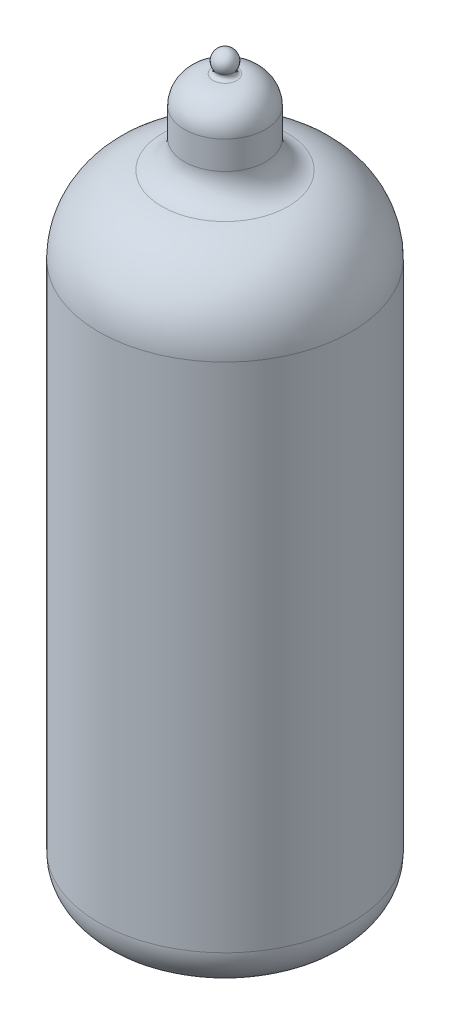
ISO-10303-21;
HEADER;
FILE_DESCRIPTION(('STEP AP214'),'2;1');
FILE_NAME('part.step','',(''),(''),'','','');
FILE_SCHEMA(('AUTOMOTIVE_DESIGN { 1 0 10303 214 1 1 1 1 }'));
ENDSEC;
DATA;
#1=APPLICATION_CONTEXT('core data for automotive mechanical design processes');
#2=APPLICATION_PROTOCOL_DEFINITION('international standard','automotive_design',2000,#1);
#3=PRODUCT_CONTEXT('',#1,'mechanical');
#4=PRODUCT('Part','Part','',(#3));
#5=PRODUCT_RELATED_PRODUCT_CATEGORY('part','',(#4));
#6=PRODUCT_DEFINITION_FORMATION('','',#4);
#7=PRODUCT_DEFINITION_CONTEXT('part definition',#1,'design');
#8=PRODUCT_DEFINITION('design','',#6,#7);
#9=PRODUCT_DEFINITION_SHAPE('','',#8);
#10=(LENGTH_UNIT() NAMED_UNIT(*) SI_UNIT(.MILLI.,.METRE.));
#11=(NAMED_UNIT(*) PLANE_ANGLE_UNIT() SI_UNIT($,.RADIAN.));
#12=(NAMED_UNIT(*) SI_UNIT($,.STERADIAN.) SOLID_ANGLE_UNIT());
#13=UNCERTAINTY_MEASURE_WITH_UNIT(LENGTH_MEASURE(1.E-05),#10,'distance_accuracy_value','');
#14=(GEOMETRIC_REPRESENTATION_CONTEXT(3) GLOBAL_UNCERTAINTY_ASSIGNED_CONTEXT((#13)) GLOBAL_UNIT_ASSIGNED_CONTEXT((#10,
#11,#12)) REPRESENTATION_CONTEXT('',''));
#15=CARTESIAN_POINT('',(0.,0.,0.));
#16=DIRECTION('',(0.,0.,1.));
#17=DIRECTION('',(1.,0.,0.));
#18=AXIS2_PLACEMENT_3D('',#15,#16,#17);
#19=CARTESIAN_POINT('',(-0.896039603960396,24.210396039604,0.));
#20=DIRECTION('',(0.,-1.,0.));
#21=DIRECTION('',(0.,0.,-1.));
#22=AXIS2_PLACEMENT_3D('',#19,#20,#21);
#23=PLANE('',#22);
#24=CARTESIAN_POINT('',(0.,24.210396039604,0.));
#25=DIRECTION('',(0.,1.,0.));
#26=DIRECTION('',(0.,0.,1.));
#27=AXIS2_PLACEMENT_3D('',#24,#25,#26);
#28=CIRCLE('',#27,0.896039603960402);
#29=CARTESIAN_POINT('',(0.,24.210396039604,0.896039603960402));
#30=VERTEX_POINT('',#29);
#31=EDGE_CURVE('E11',#30,#30,#28,.T.);
#32=ORIENTED_EDGE('',*,*,#31,.F.);
#33=EDGE_LOOP('',(#32));
#34=FACE_BOUND('',#33,.T.);
#35=ADVANCED_FACE('F36',(#34),#23,.T.);
#36=CARTESIAN_POINT('',(0.,22.710396039604,0.));
#37=DIRECTION('',(0.,1.,0.));
#38=DIRECTION('',(0.,0.,1.));
#39=AXIS2_PLACEMENT_3D('',#36,#37,#38);
#40=DEGENERATE_TOROIDAL_SURFACE('',#39,0.896039603960402,1.5,.T.);
#41=ORIENTED_EDGE('',*,*,#31,.T.);
#42=EDGE_LOOP('',(#41));
#43=FACE_BOUND('',#42,.T.);
#44=CARTESIAN_POINT('',(0.,22.710396039604,0.));
#45=DIRECTION('',(0.,1.,0.));
#46=DIRECTION('',(0.,0.,1.));
#47=AXIS2_PLACEMENT_3D('',#44,#45,#46);
#48=CIRCLE('',#47,2.3960396039604);
#49=CARTESIAN_POINT('',(0.,22.710396039604,2.3960396039604));
#50=VERTEX_POINT('',#49);
#51=EDGE_CURVE('E44',#50,#50,#48,.T.);
#52=ORIENTED_EDGE('',*,*,#51,.F.);
#53=EDGE_LOOP('',(#52));
#54=FACE_BOUND('',#53,.T.);
#55=ADVANCED_FACE('F312',(#43,#54),#40,.F.);
#56=CARTESIAN_POINT('',(0.,26.25,0.));
#57=DIRECTION('',(0.,1.,0.));
#58=DIRECTION('',(0.,0.,1.));
#59=AXIS2_PLACEMENT_3D('',#56,#57,#58);
#60=CYLINDRICAL_SURFACE('',#59,2.3960396039604);
#61=ORIENTED_EDGE('',*,*,#51,.T.);
#62=EDGE_LOOP('',(#61));
#63=FACE_BOUND('',#62,.T.);
#64=CARTESIAN_POINT('',(0.,20.710396039604,0.));
#65=DIRECTION('',(0.,1.,0.));
#66=DIRECTION('',(0.,0.,1.));
#67=AXIS2_PLACEMENT_3D('',#64,#65,#66);
#68=CIRCLE('',#67,2.3960396039604);
#69=CARTESIAN_POINT('',(0.,20.710396039604,2.3960396039604));
#70=VERTEX_POINT('',#69);
#71=EDGE_CURVE('E304',#70,#70,#68,.T.);
#72=ORIENTED_EDGE('',*,*,#71,.F.);
#73=EDGE_LOOP('',(#72));
#74=FACE_BOUND('',#73,.T.);
#75=ADVANCED_FACE('F309',(#63,#74),#60,.F.);
#76=CARTESIAN_POINT('',(0.,20.710396039604,0.));
#77=DIRECTION('',(0.,1.,0.));
#78=DIRECTION('',(0.,0.,1.));
#79=AXIS2_PLACEMENT_3D('',#76,#77,#78);
#80=TOROIDAL_SURFACE('',#79,4.8960396039604,2.5);
#81=ORIENTED_EDGE('',*,*,#71,.T.);
#82=EDGE_LOOP('',(#81));
#83=FACE_BOUND('',#82,.T.);
#84=CARTESIAN_POINT('',(0.,18.259900990099,0.));
#85=DIRECTION('',(0.,1.,0.));
#86=DIRECTION('',(0.,0.,1.));
#87=AXIS2_PLACEMENT_3D('',#84,#85,#86);
#88=CIRCLE('',#87,4.40099009900991);
#89=CARTESIAN_POINT('',(0.,18.259900990099,4.40099009900991));
#90=VERTEX_POINT('',#89);
#91=EDGE_CURVE('E301',#90,#90,#88,.T.);
#92=ORIENTED_EDGE('',*,*,#91,.F.);
#93=EDGE_LOOP('',(#92));
#94=FACE_BOUND('',#93,.T.);
#95=ADVANCED_FACE('F320',(#83,#94),#80,.T.);
#96=CARTESIAN_POINT('',(0.,13.25,0.));
#97=DIRECTION('',(0.,1.,0.));
#98=DIRECTION('',(0.,0.,1.));
#99=AXIS2_PLACEMENT_3D('',#96,#97,#98);
#100=DEGENERATE_TOROIDAL_SURFACE('',#99,3.38888888888889,5.11111111111111,.T.);
#101=ORIENTED_EDGE('',*,*,#91,.T.);
#102=EDGE_LOOP('',(#101));
#103=FACE_BOUND('',#102,.T.);
#104=CARTESIAN_POINT('',(0.,13.25,0.));
#105=DIRECTION('',(0.,1.,0.));
#106=DIRECTION('',(0.,0.,1.));
#107=AXIS2_PLACEMENT_3D('',#104,#105,#106);
#108=CIRCLE('',#107,8.5);
#109=CARTESIAN_POINT('',(0.,13.25,8.5));
#110=VERTEX_POINT('',#109);
#111=EDGE_CURVE('E298',#110,#110,#108,.T.);
#112=ORIENTED_EDGE('',*,*,#111,.F.);
#113=EDGE_LOOP('',(#112));
#114=FACE_BOUND('',#113,.T.);
#115=ADVANCED_FACE('F326',(#103,#114),#100,.F.);
#116=CARTESIAN_POINT('',(0.,26.25,0.));
#117=DIRECTION('',(0.,1.,0.));
#118=DIRECTION('',(0.,0.,1.));
#119=AXIS2_PLACEMENT_3D('',#116,#117,#118);
#120=CYLINDRICAL_SURFACE('',#119,8.5);
#121=ORIENTED_EDGE('',*,*,#111,.T.);
#122=EDGE_LOOP('',(#121));
#123=FACE_BOUND('',#122,.T.);
#124=CARTESIAN_POINT('',(0.,-21.25,0.));
#125=DIRECTION('',(0.,1.,0.));
#126=DIRECTION('',(0.,0.,1.));
#127=AXIS2_PLACEMENT_3D('',#124,#125,#126);
#128=CIRCLE('',#127,8.5);
#129=CARTESIAN_POINT('',(0.,-21.25,8.5));
#130=VERTEX_POINT('',#129);
#131=EDGE_CURVE('E295',#130,#130,#128,.T.);
#132=ORIENTED_EDGE('',*,*,#131,.F.);
#133=EDGE_LOOP('',(#132));
#134=FACE_BOUND('',#133,.T.);
#135=ADVANCED_FACE('F330',(#123,#134),#120,.F.);
#136=CARTESIAN_POINT('',(0.,-21.25,0.));
#137=DIRECTION('',(0.,1.,0.));
#138=DIRECTION('',(0.,0.,1.));
#139=AXIS2_PLACEMENT_3D('',#136,#137,#138);
#140=TOROIDAL_SURFACE('',#139,7.5,1.);
#141=ORIENTED_EDGE('',*,*,#131,.T.);
#142=EDGE_LOOP('',(#141));
#143=FACE_BOUND('',#142,.T.);
#144=CARTESIAN_POINT('',(0.,-22.25,0.));
#145=DIRECTION('',(0.,1.,0.));
#146=DIRECTION('',(0.,0.,1.));
#147=AXIS2_PLACEMENT_3D('',#144,#145,#146);
#148=CIRCLE('',#147,7.5);
#149=CARTESIAN_POINT('',(0.,-22.25,7.5));
#150=VERTEX_POINT('',#149);
#151=EDGE_CURVE('E291',#150,#150,#148,.T.);
#152=ORIENTED_EDGE('',*,*,#151,.F.);
#153=EDGE_LOOP('',(#152));
#154=FACE_BOUND('',#153,.T.);
#155=ADVANCED_FACE('F334',(#143,#154),#140,.F.);
#156=CARTESIAN_POINT('',(-7.49999999999999,-22.25,0.));
#157=DIRECTION('',(0.,1.,0.));
#158=DIRECTION('',(0.,0.,1.));
#159=AXIS2_PLACEMENT_3D('',#156,#157,#158);
#160=PLANE('',#159);
#161=CARTESIAN_POINT('',(2.67215823925168,-22.25,-5.09137214750595));
#162=DIRECTION('',(0.,1.,0.));
#163=DIRECTION('',(0.,0.,1.));
#164=AXIS2_PLACEMENT_3D('',#161,#162,#163);
#165=CIRCLE('',#164,0.25);
#166=CARTESIAN_POINT('',(2.67215823925168,-22.25,-4.84137214750595));
#167=VERTEX_POINT('',#166);
#168=EDGE_CURVE('E201',#167,#167,#165,.F.);
#169=ORIENTED_EDGE('',*,*,#168,.T.);
#170=EDGE_LOOP('',(#169));
#171=FACE_BOUND('',#170,.T.);
#172=CARTESIAN_POINT('',(4.73215722888853,-22.25,-3.26637229370414));
#173=DIRECTION('',(0.,1.,0.));
#174=DIRECTION('',(0.,0.,1.));
#175=AXIS2_PLACEMENT_3D('',#172,#173,#174);
#176=CIRCLE('',#175,0.25);
#177=CARTESIAN_POINT('',(4.73215722888853,-22.25,-3.01637229370414));
#178=VERTEX_POINT('',#177);
#179=EDGE_CURVE('E203',#178,#178,#176,.F.);
#180=ORIENTED_EDGE('',*,*,#179,.T.);
#181=EDGE_LOOP('',(#180));
#182=FACE_BOUND('',#181,.T.);
#183=CARTESIAN_POINT('',(5.70807602606381,-22.25,-0.693085911468095));
#184=DIRECTION('',(0.,1.,0.));
#185=DIRECTION('',(0.,0.,1.));
#186=AXIS2_PLACEMENT_3D('',#183,#184,#185);
#187=CIRCLE('',#186,0.25);
#188=CARTESIAN_POINT('',(5.70807602606381,-22.25,-0.443085911468095));
#189=VERTEX_POINT('',#188);
#190=EDGE_CURVE('E208',#189,#189,#187,.F.);
#191=ORIENTED_EDGE('',*,*,#190,.T.);
#192=EDGE_LOOP('',(#191));
#193=FACE_BOUND('',#192,.T.);
#194=CARTESIAN_POINT('',(5.37634339544113,-22.25,2.03897810049459));
#195=DIRECTION('',(0.,1.,0.));
#196=DIRECTION('',(0.,0.,1.));
#197=AXIS2_PLACEMENT_3D('',#194,#195,#196);
#198=CIRCLE('',#197,0.25);
#199=CARTESIAN_POINT('',(5.37634339544113,-22.25,2.28897810049459));
#200=VERTEX_POINT('',#199);
#201=EDGE_CURVE('E213',#200,#200,#198,.F.);
#202=ORIENTED_EDGE('',*,*,#201,.T.);
#203=EDGE_LOOP('',(#202));
#204=FACE_BOUND('',#203,.T.);
#205=CARTESIAN_POINT('',(3.81295528488456,-22.25,4.30393680198384));
#206=DIRECTION('',(0.,1.,0.));
#207=DIRECTION('',(0.,0.,1.));
#208=AXIS2_PLACEMENT_3D('',#205,#206,#207);
#209=CIRCLE('',#208,0.250000000000001);
#210=CARTESIAN_POINT('',(3.81295528488456,-22.25,4.55393680198384));
#211=VERTEX_POINT('',#210);
#212=EDGE_CURVE('E218',#211,#211,#209,.F.);
#213=ORIENTED_EDGE('',*,*,#212,.T.);
#214=EDGE_LOOP('',(#213));
#215=FACE_BOUND('',#214,.T.);
#216=CARTESIAN_POINT('',(1.37606506965345,-22.25,5.5829154501998));
#217=DIRECTION('',(0.,1.,0.));
#218=DIRECTION('',(0.,0.,1.));
#219=AXIS2_PLACEMENT_3D('',#216,#217,#218);
#220=CIRCLE('',#219,0.25);
#221=CARTESIAN_POINT('',(1.37606506965345,-22.25,5.8329154501998));
#222=VERTEX_POINT('',#221);
#223=EDGE_CURVE('E223',#222,#222,#220,.F.);
#224=ORIENTED_EDGE('',*,*,#223,.T.);
#225=EDGE_LOOP('',(#224));
#226=FACE_BOUND('',#225,.T.);
#227=CARTESIAN_POINT('',(-1.37606506965347,-22.25,5.5829154501998));
#228=DIRECTION('',(0.,1.,0.));
#229=DIRECTION('',(0.,0.,1.));
#230=AXIS2_PLACEMENT_3D('',#227,#228,#229);
#231=CIRCLE('',#230,0.25);
#232=CARTESIAN_POINT('',(-1.37606506965347,-22.25,5.8329154501998));
#233=VERTEX_POINT('',#232);
#234=EDGE_CURVE('E228',#233,#233,#231,.F.);
#235=ORIENTED_EDGE('',*,*,#234,.T.);
#236=EDGE_LOOP('',(#235));
#237=FACE_BOUND('',#236,.T.);
#238=CARTESIAN_POINT('',(-3.81295528488458,-22.25,4.30393680198382));
#239=DIRECTION('',(0.,1.,0.));
#240=DIRECTION('',(0.,0.,1.));
#241=AXIS2_PLACEMENT_3D('',#238,#239,#240);
#242=CIRCLE('',#241,0.25);
#243=CARTESIAN_POINT('',(-3.81295528488458,-22.25,4.55393680198382));
#244=VERTEX_POINT('',#243);
#245=EDGE_CURVE('E233',#244,#244,#242,.F.);
#246=ORIENTED_EDGE('',*,*,#245,.T.);
#247=EDGE_LOOP('',(#246));
#248=FACE_BOUND('',#247,.T.);
#249=CARTESIAN_POINT('',(-5.37634339544114,-22.25,2.03897810049457));
#250=DIRECTION('',(0.,1.,0.));
#251=DIRECTION('',(0.,0.,1.));
#252=AXIS2_PLACEMENT_3D('',#249,#250,#251);
#253=CIRCLE('',#252,0.25);
#254=CARTESIAN_POINT('',(-5.37634339544114,-22.25,2.28897810049457));
#255=VERTEX_POINT('',#254);
#256=EDGE_CURVE('E238',#255,#255,#253,.F.);
#257=ORIENTED_EDGE('',*,*,#256,.T.);
#258=EDGE_LOOP('',(#257));
#259=FACE_BOUND('',#258,.T.);
#260=CARTESIAN_POINT('',(-5.70807602606381,-22.25,-0.693085911468117));
#261=DIRECTION('',(0.,1.,0.));
#262=DIRECTION('',(0.,0.,1.));
#263=AXIS2_PLACEMENT_3D('',#260,#261,#262);
#264=CIRCLE('',#263,0.25);
#265=CARTESIAN_POINT('',(-5.70807602606381,-22.25,-0.443085911468116));
#266=VERTEX_POINT('',#265);
#267=EDGE_CURVE('E243',#266,#266,#264,.F.);
#268=ORIENTED_EDGE('',*,*,#267,.T.);
#269=EDGE_LOOP('',(#268));
#270=FACE_BOUND('',#269,.T.);
#271=CARTESIAN_POINT('',(-4.73215722888852,-22.25,-3.26637229370415));
#272=DIRECTION('',(0.,1.,0.));
#273=DIRECTION('',(0.,0.,1.));
#274=AXIS2_PLACEMENT_3D('',#271,#272,#273);
#275=CIRCLE('',#274,0.250000000000001);
#276=CARTESIAN_POINT('',(-4.73215722888852,-22.25,-3.01637229370415));
#277=VERTEX_POINT('',#276);
#278=EDGE_CURVE('E248',#277,#277,#275,.F.);
#279=ORIENTED_EDGE('',*,*,#278,.T.);
#280=EDGE_LOOP('',(#279));
#281=FACE_BOUND('',#280,.T.);
#282=CARTESIAN_POINT('',(-2.67215823925166,-22.25,-5.09137214750596));
#283=DIRECTION('',(0.,1.,0.));
#284=DIRECTION('',(0.,0.,1.));
#285=AXIS2_PLACEMENT_3D('',#282,#283,#284);
#286=CIRCLE('',#285,0.25);
#287=CARTESIAN_POINT('',(-2.67215823925166,-22.25,-4.84137214750596));
#288=VERTEX_POINT('',#287);
#289=EDGE_CURVE('E253',#288,#288,#286,.F.);
#290=ORIENTED_EDGE('',*,*,#289,.T.);
#291=EDGE_LOOP('',(#290));
#292=FACE_BOUND('',#291,.T.);
#293=CARTESIAN_POINT('',(0.,-22.25,-5.75));
#294=DIRECTION('',(0.,1.,0.));
#295=DIRECTION('',(0.,0.,1.));
#296=AXIS2_PLACEMENT_3D('',#293,#294,#295);
#297=CIRCLE('',#296,0.25);
#298=CARTESIAN_POINT('',(0.,-22.25,-5.5));
#299=VERTEX_POINT('',#298);
#300=EDGE_CURVE('E258',#299,#299,#297,.F.);
#301=ORIENTED_EDGE('',*,*,#300,.T.);
#302=EDGE_LOOP('',(#301));
#303=FACE_BOUND('',#302,.T.);
#304=ORIENTED_EDGE('',*,*,#151,.T.);
#305=EDGE_LOOP('',(#304));
#306=FACE_BOUND('',#305,.T.);
#307=ADVANCED_FACE('F338',(#171,#182,#193,#204,#215,#226,#237,#248,#259,#270,#281,#292,#303,
#306),#160,.T.);
#308=CARTESIAN_POINT('',(0.,26.251,-5.75));
#309=DIRECTION('',(0.,-1.,0.));
#310=DIRECTION('',(0.,0.,-1.));
#311=AXIS2_PLACEMENT_3D('',#308,#309,#310);
#312=CYLINDRICAL_SURFACE('',#311,0.25);
#313=ORIENTED_EDGE('',*,*,#300,.F.);
#314=EDGE_LOOP('',(#313));
#315=FACE_BOUND('',#314,.T.);
#316=CARTESIAN_POINT('',(0.,-26.25,-5.75));
#317=DIRECTION('',(0.,-1.,0.));
#318=DIRECTION('',(0.,0.,-1.));
#319=AXIS2_PLACEMENT_3D('',#316,#317,#318);
#320=CIRCLE('',#319,0.25);
#321=CARTESIAN_POINT('',(0.,-26.25,-6.));
#322=VERTEX_POINT('',#321);
#323=EDGE_CURVE('E261',#322,#322,#320,.T.);
#324=ORIENTED_EDGE('',*,*,#323,.T.);
#325=EDGE_LOOP('',(#324));
#326=FACE_BOUND('',#325,.T.);
#327=ADVANCED_FACE('F342',(#315,#326),#312,.F.);
#328=CARTESIAN_POINT('',(0.,25.5,0.));
#329=DIRECTION('',(0.,1.,0.));
#330=DIRECTION('',(1.,0.,0.));
#331=AXIS2_PLACEMENT_3D('',#328,#329,#330);
#332=SPHERICAL_SURFACE('',#331,0.750000000000001);
#333=CARTESIAN_POINT('',(0.,25.0948011010718,0.));
#334=DIRECTION('',(0.,1.,0.));
#335=DIRECTION('',(0.,0.,1.));
#336=AXIS2_PLACEMENT_3D('',#333,#334,#335);
#337=CIRCLE('',#336,0.631121107480484);
#338=CARTESIAN_POINT('',(0.,25.0948011010718,0.631121107480484));
#339=VERTEX_POINT('',#338);
#340=EDGE_CURVE('E264',#339,#339,#337,.T.);
#341=ORIENTED_EDGE('',*,*,#340,.T.);
#342=EDGE_LOOP('',(#341));
#343=FACE_BOUND('',#342,.T.);
#344=ADVANCED_FACE('F38',(#343),#332,.T.);
#345=CARTESIAN_POINT('',(0.,-26.25,0.));
#346=DIRECTION('',(0.,-1.,0.));
#347=DIRECTION('',(0.,0.,-1.));
#348=AXIS2_PLACEMENT_3D('',#345,#346,#347);
#349=PLANE('',#348);
#350=CARTESIAN_POINT('',(0.,-26.25,0.));
#351=DIRECTION('',(0.,-1.,0.));
#352=DIRECTION('',(0.,0.,-1.));
#353=AXIS2_PLACEMENT_3D('',#350,#351,#352);
#354=CIRCLE('',#353,3.);
#355=CARTESIAN_POINT('',(0.,-26.25,-3.));
#356=VERTEX_POINT('',#355);
#357=EDGE_CURVE('E168',#356,#356,#354,.T.);
#358=ORIENTED_EDGE('',*,*,#357,.F.);
#359=EDGE_LOOP('',(#358));
#360=FACE_BOUND('',#359,.T.);
#361=CARTESIAN_POINT('',(0.,-26.25,0.));
#362=DIRECTION('',(0.,1.,0.));
#363=DIRECTION('',(0.,0.,1.));
#364=AXIS2_PLACEMENT_3D('',#361,#362,#363);
#365=CIRCLE('',#364,6.);
#366=CARTESIAN_POINT('',(2.78833903226262,-26.25,-5.31273615391926));
#367=VERTEX_POINT('',#366);
#368=EDGE_CURVE('E287',#367,#322,#365,.T.);
#369=ORIENTED_EDGE('',*,*,#368,.F.);
#370=CARTESIAN_POINT('',(2.67215823925168,-26.25,-5.09137214750595));
#371=DIRECTION('',(0.,-1.,0.));
#372=DIRECTION('',(0.,0.,-1.));
#373=AXIS2_PLACEMENT_3D('',#370,#371,#372);
#374=CIRCLE('',#373,0.25);
#375=EDGE_CURVE('E57',#367,#367,#374,.T.);
#376=ORIENTED_EDGE('',*,*,#375,.F.);
#377=CARTESIAN_POINT('',(4.93790319536195,-26.25,-3.40838848038693));
#378=VERTEX_POINT('',#377);
#379=EDGE_CURVE('E473',#378,#367,#365,.T.);
#380=ORIENTED_EDGE('',*,*,#379,.F.);
#381=CARTESIAN_POINT('',(4.73215722888853,-26.25,-3.26637229370414));
#382=DIRECTION('',(0.,-1.,0.));
#383=DIRECTION('',(0.,0.,-1.));
#384=AXIS2_PLACEMENT_3D('',#381,#382,#383);
#385=CIRCLE('',#384,0.25);
#386=EDGE_CURVE('E206',#378,#378,#385,.T.);
#387=ORIENTED_EDGE('',*,*,#386,.F.);
#388=CARTESIAN_POINT('',(5.95625324458833,-26.25,-0.723220081531926));
#389=VERTEX_POINT('',#388);
#390=EDGE_CURVE('E478',#389,#378,#365,.T.);
#391=ORIENTED_EDGE('',*,*,#390,.F.);
#392=CARTESIAN_POINT('',(5.70807602606381,-26.25,-0.693085911468095));
#393=DIRECTION('',(0.,-1.,0.));
#394=DIRECTION('',(0.,0.,-1.));
#395=AXIS2_PLACEMENT_3D('',#392,#393,#394);
#396=CIRCLE('',#395,0.25);
#397=EDGE_CURVE('E211',#389,#389,#396,.T.);
#398=ORIENTED_EDGE('',*,*,#397,.F.);
#399=CARTESIAN_POINT('',(5.61009745611249,-26.25,2.12762932225523));
#400=VERTEX_POINT('',#399);
#401=EDGE_CURVE('E480',#400,#389,#365,.T.);
#402=ORIENTED_EDGE('',*,*,#401,.F.);
#403=CARTESIAN_POINT('',(5.37634339544113,-26.25,2.03897810049459));
#404=DIRECTION('',(0.,-1.,0.));
#405=DIRECTION('',(0.,0.,-1.));
#406=AXIS2_PLACEMENT_3D('',#403,#404,#405);
#407=CIRCLE('',#406,0.25);
#408=EDGE_CURVE('E216',#400,#400,#407,.T.);
#409=ORIENTED_EDGE('',*,*,#408,.F.);
#410=CARTESIAN_POINT('',(3.97873594944477,-26.25,4.49106448902662));
#411=VERTEX_POINT('',#410);
#412=EDGE_CURVE('E481',#411,#400,#365,.T.);
#413=ORIENTED_EDGE('',*,*,#412,.F.);
#414=CARTESIAN_POINT('',(3.81295528488456,-26.25,4.30393680198384));
#415=DIRECTION('',(0.,-1.,0.));
#416=DIRECTION('',(0.,0.,-1.));
#417=AXIS2_PLACEMENT_3D('',#414,#415,#416);
#418=CIRCLE('',#417,0.250000000000001);
#419=EDGE_CURVE('E221',#411,#411,#418,.T.);
#420=ORIENTED_EDGE('',*,*,#419,.F.);
#421=CARTESIAN_POINT('',(1.43589398572534,-26.25,5.82565090455632));
#422=VERTEX_POINT('',#421);
#423=EDGE_CURVE('E484',#422,#411,#365,.T.);
#424=ORIENTED_EDGE('',*,*,#423,.F.);
#425=CARTESIAN_POINT('',(1.37606506965345,-26.25,5.5829154501998));
#426=DIRECTION('',(0.,-1.,0.));
#427=DIRECTION('',(0.,0.,-1.));
#428=AXIS2_PLACEMENT_3D('',#425,#426,#427);
#429=CIRCLE('',#428,0.25);
#430=EDGE_CURVE('E226',#422,#422,#429,.T.);
#431=ORIENTED_EDGE('',*,*,#430,.F.);
#432=CARTESIAN_POINT('',(-1.43589398572536,-26.25,5.82565090455631));
#433=VERTEX_POINT('',#432);
#434=EDGE_CURVE('E487',#433,#422,#365,.T.);
#435=ORIENTED_EDGE('',*,*,#434,.F.);
#436=CARTESIAN_POINT('',(-1.37606506965347,-26.25,5.5829154501998));
#437=DIRECTION('',(0.,-1.,0.));
#438=DIRECTION('',(0.,0.,-1.));
#439=AXIS2_PLACEMENT_3D('',#436,#437,#438);
#440=CIRCLE('',#439,0.25);
#441=EDGE_CURVE('E231',#433,#433,#440,.T.);
#442=ORIENTED_EDGE('',*,*,#441,.F.);
#443=CARTESIAN_POINT('',(-3.97873594944478,-26.25,4.4910644890266));
#444=VERTEX_POINT('',#443);
#445=EDGE_CURVE('E490',#444,#433,#365,.T.);
#446=ORIENTED_EDGE('',*,*,#445,.F.);
#447=CARTESIAN_POINT('',(-3.81295528488458,-26.25,4.30393680198382));
#448=DIRECTION('',(0.,-1.,0.));
#449=DIRECTION('',(0.,0.,-1.));
#450=AXIS2_PLACEMENT_3D('',#447,#448,#449);
#451=CIRCLE('',#450,0.25);
#452=EDGE_CURVE('E236',#444,#444,#451,.T.);
#453=ORIENTED_EDGE('',*,*,#452,.F.);
#454=CARTESIAN_POINT('',(-5.61009745611249,-26.25,2.1276293222552));
#455=VERTEX_POINT('',#454);
#456=EDGE_CURVE('E493',#455,#444,#365,.T.);
#457=ORIENTED_EDGE('',*,*,#456,.F.);
#458=CARTESIAN_POINT('',(-5.37634339544114,-26.25,2.03897810049457));
#459=DIRECTION('',(0.,-1.,0.));
#460=DIRECTION('',(0.,0.,-1.));
#461=AXIS2_PLACEMENT_3D('',#458,#459,#460);
#462=CIRCLE('',#461,0.25);
#463=EDGE_CURVE('E241',#455,#455,#462,.T.);
#464=ORIENTED_EDGE('',*,*,#463,.F.);
#465=CARTESIAN_POINT('',(-5.95625324458832,-26.25,-0.723220081531947));
#466=VERTEX_POINT('',#465);
#467=EDGE_CURVE('E496',#466,#455,#365,.T.);
#468=ORIENTED_EDGE('',*,*,#467,.F.);
#469=CARTESIAN_POINT('',(-5.70807602606381,-26.25,-0.693085911468117));
#470=DIRECTION('',(0.,-1.,0.));
#471=DIRECTION('',(0.,0.,-1.));
#472=AXIS2_PLACEMENT_3D('',#469,#470,#471);
#473=CIRCLE('',#472,0.25);
#474=EDGE_CURVE('E246',#466,#466,#473,.T.);
#475=ORIENTED_EDGE('',*,*,#474,.F.);
#476=CARTESIAN_POINT('',(-4.93790319536193,-26.25,-3.40838848038694));
#477=VERTEX_POINT('',#476);
#478=EDGE_CURVE('E499',#477,#466,#365,.T.);
#479=ORIENTED_EDGE('',*,*,#478,.F.);
#480=CARTESIAN_POINT('',(-4.73215722888852,-26.25,-3.26637229370415));
#481=DIRECTION('',(0.,-1.,0.));
#482=DIRECTION('',(0.,0.,-1.));
#483=AXIS2_PLACEMENT_3D('',#480,#481,#482);
#484=CIRCLE('',#483,0.250000000000001);
#485=EDGE_CURVE('E251',#477,#477,#484,.T.);
#486=ORIENTED_EDGE('',*,*,#485,.F.);
#487=CARTESIAN_POINT('',(-2.7883390322626,-26.25,-5.31273615391926));
#488=VERTEX_POINT('',#487);
#489=EDGE_CURVE('E292',#488,#477,#365,.T.);
#490=ORIENTED_EDGE('',*,*,#489,.F.);
#491=CARTESIAN_POINT('',(-2.67215823925166,-26.25,-5.09137214750596));
#492=DIRECTION('',(0.,-1.,0.));
#493=DIRECTION('',(0.,0.,-1.));
#494=AXIS2_PLACEMENT_3D('',#491,#492,#493);
#495=CIRCLE('',#494,0.25);
#496=EDGE_CURVE('E256',#488,#488,#495,.T.);
#497=ORIENTED_EDGE('',*,*,#496,.F.);
#498=EDGE_CURVE('E288',#322,#488,#365,.T.);
#499=ORIENTED_EDGE('',*,*,#498,.F.);
#500=ORIENTED_EDGE('',*,*,#323,.F.);
#501=EDGE_LOOP('',(#369,#376,#380,#387,#391,#398,#402,#409,#413,#420,#424,#431,#435,#442,#446,
#453,#457,#464,#468,#475,#479,#486,#490,#497,#499,#500));
#502=FACE_BOUND('',#501,.T.);
#503=ADVANCED_FACE('F344',(#360,#502),#349,.T.);
#504=CARTESIAN_POINT('',(0.,-23.25,0.));
#505=DIRECTION('',(0.,1.,0.));
#506=DIRECTION('',(0.,0.,1.));
#507=AXIS2_PLACEMENT_3D('',#504,#505,#506);
#508=TOROIDAL_SURFACE('',#507,6.,3.);
#509=ORIENTED_EDGE('',*,*,#498,.T.);
#510=ORIENTED_EDGE('',*,*,#489,.T.);
#511=ORIENTED_EDGE('',*,*,#478,.T.);
#512=ORIENTED_EDGE('',*,*,#467,.T.);
#513=ORIENTED_EDGE('',*,*,#456,.T.);
#514=ORIENTED_EDGE('',*,*,#445,.T.);
#515=ORIENTED_EDGE('',*,*,#434,.T.);
#516=ORIENTED_EDGE('',*,*,#423,.T.);
#517=ORIENTED_EDGE('',*,*,#412,.T.);
#518=ORIENTED_EDGE('',*,*,#401,.T.);
#519=ORIENTED_EDGE('',*,*,#390,.T.);
#520=ORIENTED_EDGE('',*,*,#379,.T.);
#521=ORIENTED_EDGE('',*,*,#368,.T.);
#522=EDGE_LOOP('',(#509,#510,#511,#512,#513,#514,#515,#516,#517,#518,#519,#520,#521));
#523=FACE_BOUND('',#522,.T.);
#524=CARTESIAN_POINT('',(0.,-23.25,0.));
#525=DIRECTION('',(0.,1.,0.));
#526=DIRECTION('',(0.,0.,1.));
#527=AXIS2_PLACEMENT_3D('',#524,#525,#526);
#528=CIRCLE('',#527,9.);
#529=CARTESIAN_POINT('',(0.,-23.25,9.));
#530=VERTEX_POINT('',#529);
#531=EDGE_CURVE('E284',#530,#530,#528,.T.);
#532=ORIENTED_EDGE('',*,*,#531,.F.);
#533=EDGE_LOOP('',(#532));
#534=FACE_BOUND('',#533,.T.);
#535=ADVANCED_FACE('F347',(#523,#534),#508,.T.);
#536=CARTESIAN_POINT('',(0.,26.25,0.));
#537=DIRECTION('',(0.,1.,0.));
#538=DIRECTION('',(0.,0.,1.));
#539=AXIS2_PLACEMENT_3D('',#536,#537,#538);
#540=CYLINDRICAL_SURFACE('',#539,9.);
#541=ORIENTED_EDGE('',*,*,#531,.T.);
#542=EDGE_LOOP('',(#541));
#543=FACE_BOUND('',#542,.T.);
#544=CARTESIAN_POINT('',(0.,13.25,0.));
#545=DIRECTION('',(0.,1.,0.));
#546=DIRECTION('',(0.,0.,1.));
#547=AXIS2_PLACEMENT_3D('',#544,#545,#546);
#548=CIRCLE('',#547,9.);
#549=CARTESIAN_POINT('',(0.,13.25,9.));
#550=VERTEX_POINT('',#549);
#551=EDGE_CURVE('E281',#550,#550,#548,.T.);
#552=ORIENTED_EDGE('',*,*,#551,.F.);
#553=EDGE_LOOP('',(#552));
#554=FACE_BOUND('',#553,.T.);
#555=ADVANCED_FACE('F351',(#543,#554),#540,.T.);
#556=CARTESIAN_POINT('',(0.,13.25,0.));
#557=DIRECTION('',(0.,1.,0.));
#558=DIRECTION('',(0.,0.,1.));
#559=AXIS2_PLACEMENT_3D('',#556,#557,#558);
#560=DEGENERATE_TOROIDAL_SURFACE('',#559,3.38888888888889,5.61111111111111,.T.);
#561=ORIENTED_EDGE('',*,*,#551,.T.);
#562=EDGE_LOOP('',(#561));
#563=FACE_BOUND('',#562,.T.);
#564=CARTESIAN_POINT('',(0.,18.75,0.));
#565=DIRECTION('',(0.,1.,0.));
#566=DIRECTION('',(0.,0.,1.));
#567=AXIS2_PLACEMENT_3D('',#564,#565,#566);
#568=CIRCLE('',#567,4.5);
#569=CARTESIAN_POINT('',(0.,18.75,4.5));
#570=VERTEX_POINT('',#569);
#571=EDGE_CURVE('E278',#570,#570,#568,.T.);
#572=ORIENTED_EDGE('',*,*,#571,.F.);
#573=EDGE_LOOP('',(#572));
#574=FACE_BOUND('',#573,.T.);
#575=ADVANCED_FACE('F355',(#563,#574),#560,.T.);
#576=CARTESIAN_POINT('',(0.,20.710396039604,0.));
#577=DIRECTION('',(0.,1.,0.));
#578=DIRECTION('',(0.,0.,1.));
#579=AXIS2_PLACEMENT_3D('',#576,#577,#578);
#580=TOROIDAL_SURFACE('',#579,4.8960396039604,2.);
#581=ORIENTED_EDGE('',*,*,#571,.T.);
#582=EDGE_LOOP('',(#581));
#583=FACE_BOUND('',#582,.T.);
#584=CARTESIAN_POINT('',(0.,20.710396039604,0.));
#585=DIRECTION('',(0.,1.,0.));
#586=DIRECTION('',(0.,0.,1.));
#587=AXIS2_PLACEMENT_3D('',#584,#585,#586);
#588=CIRCLE('',#587,2.8960396039604);
#589=CARTESIAN_POINT('',(0.,20.710396039604,2.8960396039604));
#590=VERTEX_POINT('',#589);
#591=EDGE_CURVE('E275',#590,#590,#588,.T.);
#592=ORIENTED_EDGE('',*,*,#591,.F.);
#593=EDGE_LOOP('',(#592));
#594=FACE_BOUND('',#593,.T.);
#595=ADVANCED_FACE('F359',(#583,#594),#580,.F.);
#596=CARTESIAN_POINT('',(0.,26.25,0.));
#597=DIRECTION('',(0.,1.,0.));
#598=DIRECTION('',(0.,0.,1.));
#599=AXIS2_PLACEMENT_3D('',#596,#597,#598);
#600=CYLINDRICAL_SURFACE('',#599,2.8960396039604);
#601=ORIENTED_EDGE('',*,*,#591,.T.);
#602=EDGE_LOOP('',(#601));
#603=FACE_BOUND('',#602,.T.);
#604=CARTESIAN_POINT('',(0.,22.710396039604,0.));
#605=DIRECTION('',(0.,1.,0.));
#606=DIRECTION('',(0.,0.,1.));
#607=AXIS2_PLACEMENT_3D('',#604,#605,#606);
#608=CIRCLE('',#607,2.8960396039604);
#609=CARTESIAN_POINT('',(0.,22.710396039604,2.8960396039604));
#610=VERTEX_POINT('',#609);
#611=EDGE_CURVE('E272',#610,#610,#608,.T.);
#612=ORIENTED_EDGE('',*,*,#611,.F.);
#613=EDGE_LOOP('',(#612));
#614=FACE_BOUND('',#613,.T.);
#615=ADVANCED_FACE('F363',(#603,#614),#600,.T.);
#616=CARTESIAN_POINT('',(0.,22.710396039604,0.));
#617=DIRECTION('',(0.,1.,0.));
#618=DIRECTION('',(0.,0.,1.));
#619=AXIS2_PLACEMENT_3D('',#616,#617,#618);
#620=DEGENERATE_TOROIDAL_SURFACE('',#619,0.896039603960402,2.,.T.);
#621=ORIENTED_EDGE('',*,*,#611,.T.);
#622=EDGE_LOOP('',(#621));
#623=FACE_BOUND('',#622,.T.);
#624=CARTESIAN_POINT('',(0.,24.7098082723374,0.));
#625=DIRECTION('',(0.,1.,0.));
#626=DIRECTION('',(0.,0.,1.));
#627=AXIS2_PLACEMENT_3D('',#624,#625,#626);
#628=CIRCLE('',#627,0.847555342639136);
#629=CARTESIAN_POINT('',(0.,24.7098082723374,0.847555342639136));
#630=VERTEX_POINT('',#629);
#631=EDGE_CURVE('E269',#630,#630,#628,.T.);
#632=ORIENTED_EDGE('',*,*,#631,.F.);
#633=EDGE_LOOP('',(#632));
#634=FACE_BOUND('',#633,.T.);
#635=ADVANCED_FACE('F367',(#623,#634),#620,.T.);
#636=CARTESIAN_POINT('',(0.,24.9597348014291,0.));
#637=DIRECTION('',(0.,1.,0.));
#638=DIRECTION('',(0.,0.,1.));
#639=AXIS2_PLACEMENT_3D('',#636,#637,#638);
#640=TOROIDAL_SURFACE('',#639,0.841494809973977,0.25);
#641=ORIENTED_EDGE('',*,*,#631,.T.);
#642=EDGE_LOOP('',(#641));
#643=FACE_BOUND('',#642,.T.);
#644=ORIENTED_EDGE('',*,*,#340,.F.);
#645=EDGE_LOOP('',(#644));
#646=FACE_BOUND('',#645,.T.);
#647=ADVANCED_FACE('F371',(#643,#646),#640,.F.);
#648=CARTESIAN_POINT('',(-2.67215823925166,26.251,-5.09137214750596));
#649=DIRECTION('',(0.,-1.,0.));
#650=DIRECTION('',(0.,0.,-1.));
#651=AXIS2_PLACEMENT_3D('',#648,#649,#650);
#652=CYLINDRICAL_SURFACE('',#651,0.25);
#653=ORIENTED_EDGE('',*,*,#289,.F.);
#654=EDGE_LOOP('',(#653));
#655=FACE_BOUND('',#654,.T.);
#656=ORIENTED_EDGE('',*,*,#496,.T.);
#657=EDGE_LOOP('',(#656));
#658=FACE_BOUND('',#657,.T.);
#659=ADVANCED_FACE('F375',(#655,#658),#652,.F.);
#660=CARTESIAN_POINT('',(-4.73215722888852,26.251,-3.26637229370415));
#661=DIRECTION('',(0.,-1.,0.));
#662=DIRECTION('',(0.,0.,-1.));
#663=AXIS2_PLACEMENT_3D('',#660,#661,#662);
#664=CYLINDRICAL_SURFACE('',#663,0.250000000000001);
#665=ORIENTED_EDGE('',*,*,#278,.F.);
#666=EDGE_LOOP('',(#665));
#667=FACE_BOUND('',#666,.T.);
#668=ORIENTED_EDGE('',*,*,#485,.T.);
#669=EDGE_LOOP('',(#668));
#670=FACE_BOUND('',#669,.T.);
#671=ADVANCED_FACE('F382',(#667,#670),#664,.F.);
#672=CARTESIAN_POINT('',(-5.70807602606381,26.251,-0.693085911468117));
#673=DIRECTION('',(0.,-1.,0.));
#674=DIRECTION('',(0.,0.,-1.));
#675=AXIS2_PLACEMENT_3D('',#672,#673,#674);
#676=CYLINDRICAL_SURFACE('',#675,0.25);
#677=ORIENTED_EDGE('',*,*,#267,.F.);
#678=EDGE_LOOP('',(#677));
#679=FACE_BOUND('',#678,.T.);
#680=ORIENTED_EDGE('',*,*,#474,.T.);
#681=EDGE_LOOP('',(#680));
#682=FACE_BOUND('',#681,.T.);
#683=ADVANCED_FACE('F386',(#679,#682),#676,.F.);
#684=CARTESIAN_POINT('',(-5.37634339544114,26.251,2.03897810049457));
#685=DIRECTION('',(0.,-1.,0.));
#686=DIRECTION('',(0.,0.,-1.));
#687=AXIS2_PLACEMENT_3D('',#684,#685,#686);
#688=CYLINDRICAL_SURFACE('',#687,0.25);
#689=ORIENTED_EDGE('',*,*,#256,.F.);
#690=EDGE_LOOP('',(#689));
#691=FACE_BOUND('',#690,.T.);
#692=ORIENTED_EDGE('',*,*,#463,.T.);
#693=EDGE_LOOP('',(#692));
#694=FACE_BOUND('',#693,.T.);
#695=ADVANCED_FACE('F390',(#691,#694),#688,.F.);
#696=CARTESIAN_POINT('',(-3.81295528488458,26.251,4.30393680198382));
#697=DIRECTION('',(0.,-1.,0.));
#698=DIRECTION('',(0.,0.,-1.));
#699=AXIS2_PLACEMENT_3D('',#696,#697,#698);
#700=CYLINDRICAL_SURFACE('',#699,0.25);
#701=ORIENTED_EDGE('',*,*,#245,.F.);
#702=EDGE_LOOP('',(#701));
#703=FACE_BOUND('',#702,.T.);
#704=ORIENTED_EDGE('',*,*,#452,.T.);
#705=EDGE_LOOP('',(#704));
#706=FACE_BOUND('',#705,.T.);
#707=ADVANCED_FACE('F394',(#703,#706),#700,.F.);
#708=CARTESIAN_POINT('',(-1.37606506965347,26.251,5.5829154501998));
#709=DIRECTION('',(0.,-1.,0.));
#710=DIRECTION('',(0.,0.,-1.));
#711=AXIS2_PLACEMENT_3D('',#708,#709,#710);
#712=CYLINDRICAL_SURFACE('',#711,0.25);
#713=ORIENTED_EDGE('',*,*,#234,.F.);
#714=EDGE_LOOP('',(#713));
#715=FACE_BOUND('',#714,.T.);
#716=ORIENTED_EDGE('',*,*,#441,.T.);
#717=EDGE_LOOP('',(#716));
#718=FACE_BOUND('',#717,.T.);
#719=ADVANCED_FACE('F398',(#715,#718),#712,.F.);
#720=CARTESIAN_POINT('',(1.37606506965345,26.251,5.5829154501998));
#721=DIRECTION('',(0.,-1.,0.));
#722=DIRECTION('',(0.,0.,-1.));
#723=AXIS2_PLACEMENT_3D('',#720,#721,#722);
#724=CYLINDRICAL_SURFACE('',#723,0.25);
#725=ORIENTED_EDGE('',*,*,#223,.F.);
#726=EDGE_LOOP('',(#725));
#727=FACE_BOUND('',#726,.T.);
#728=ORIENTED_EDGE('',*,*,#430,.T.);
#729=EDGE_LOOP('',(#728));
#730=FACE_BOUND('',#729,.T.);
#731=ADVANCED_FACE('F402',(#727,#730),#724,.F.);
#732=CARTESIAN_POINT('',(3.81295528488456,26.251,4.30393680198384));
#733=DIRECTION('',(0.,-1.,0.));
#734=DIRECTION('',(0.,0.,-1.));
#735=AXIS2_PLACEMENT_3D('',#732,#733,#734);
#736=CYLINDRICAL_SURFACE('',#735,0.250000000000001);
#737=ORIENTED_EDGE('',*,*,#212,.F.);
#738=EDGE_LOOP('',(#737));
#739=FACE_BOUND('',#738,.T.);
#740=ORIENTED_EDGE('',*,*,#419,.T.);
#741=EDGE_LOOP('',(#740));
#742=FACE_BOUND('',#741,.T.);
#743=ADVANCED_FACE('F406',(#739,#742),#736,.F.);
#744=CARTESIAN_POINT('',(5.37634339544113,26.251,2.03897810049459));
#745=DIRECTION('',(0.,-1.,0.));
#746=DIRECTION('',(0.,0.,-1.));
#747=AXIS2_PLACEMENT_3D('',#744,#745,#746);
#748=CYLINDRICAL_SURFACE('',#747,0.25);
#749=ORIENTED_EDGE('',*,*,#201,.F.);
#750=EDGE_LOOP('',(#749));
#751=FACE_BOUND('',#750,.T.);
#752=ORIENTED_EDGE('',*,*,#408,.T.);
#753=EDGE_LOOP('',(#752));
#754=FACE_BOUND('',#753,.T.);
#755=ADVANCED_FACE('F410',(#751,#754),#748,.F.);
#756=CARTESIAN_POINT('',(5.70807602606381,26.251,-0.693085911468095));
#757=DIRECTION('',(0.,-1.,0.));
#758=DIRECTION('',(0.,0.,-1.));
#759=AXIS2_PLACEMENT_3D('',#756,#757,#758);
#760=CYLINDRICAL_SURFACE('',#759,0.25);
#761=ORIENTED_EDGE('',*,*,#190,.F.);
#762=EDGE_LOOP('',(#761));
#763=FACE_BOUND('',#762,.T.);
#764=ORIENTED_EDGE('',*,*,#397,.T.);
#765=EDGE_LOOP('',(#764));
#766=FACE_BOUND('',#765,.T.);
#767=ADVANCED_FACE('F414',(#763,#766),#760,.F.);
#768=CARTESIAN_POINT('',(4.73215722888853,26.251,-3.26637229370414));
#769=DIRECTION('',(0.,-1.,0.));
#770=DIRECTION('',(0.,0.,-1.));
#771=AXIS2_PLACEMENT_3D('',#768,#769,#770);
#772=CYLINDRICAL_SURFACE('',#771,0.25);
#773=ORIENTED_EDGE('',*,*,#179,.F.);
#774=EDGE_LOOP('',(#773));
#775=FACE_BOUND('',#774,.T.);
#776=ORIENTED_EDGE('',*,*,#386,.T.);
#777=EDGE_LOOP('',(#776));
#778=FACE_BOUND('',#777,.T.);
#779=ADVANCED_FACE('F418',(#775,#778),#772,.F.);
#780=CARTESIAN_POINT('',(2.67215823925168,26.251,-5.09137214750595));
#781=DIRECTION('',(0.,-1.,0.));
#782=DIRECTION('',(0.,0.,-1.));
#783=AXIS2_PLACEMENT_3D('',#780,#781,#782);
#784=CYLINDRICAL_SURFACE('',#783,0.25);
#785=ORIENTED_EDGE('',*,*,#168,.F.);
#786=EDGE_LOOP('',(#785));
#787=FACE_BOUND('',#786,.T.);
#788=ORIENTED_EDGE('',*,*,#375,.T.);
#789=EDGE_LOOP('',(#788));
#790=FACE_BOUND('',#789,.T.);
#791=ADVANCED_FACE('F422',(#787,#790),#784,.F.);
#792=CARTESIAN_POINT('',(0.,-26.25,0.));
#793=DIRECTION('',(0.,-1.,0.));
#794=DIRECTION('',(0.,0.,-1.));
#795=AXIS2_PLACEMENT_3D('',#792,#793,#794);
#796=CONICAL_SURFACE('',#795,3.,0.261799387799149);
#797=CARTESIAN_POINT('',(0.,-25.75,0.));
#798=DIRECTION('',(0.,-1.,0.));
#799=DIRECTION('',(0.,0.,-1.));
#800=AXIS2_PLACEMENT_3D('',#797,#798,#799);
#801=CIRCLE('',#800,2.86602540378444);
#802=CARTESIAN_POINT('',(0.,-25.75,-2.86602540378444));
#803=VERTEX_POINT('',#802);
#804=EDGE_CURVE('E171',#803,#803,#801,.T.);
#805=ORIENTED_EDGE('',*,*,#804,.F.);
#806=EDGE_LOOP('',(#805));
#807=FACE_BOUND('',#806,.T.);
#808=ORIENTED_EDGE('',*,*,#357,.T.);
#809=EDGE_LOOP('',(#808));
#810=FACE_BOUND('',#809,.T.);
#811=ADVANCED_FACE('F426',(#807,#810),#796,.F.);
#812=CARTESIAN_POINT('',(0.,-25.75,0.));
#813=DIRECTION('',(0.,-1.,0.));
#814=DIRECTION('',(0.,0.,-1.));
#815=AXIS2_PLACEMENT_3D('',#812,#813,#814);
#816=PLANE('',#815);
#817=DIRECTION('',(1.,0.,0.));
#818=VECTOR('',#817,1.);
#819=CARTESIAN_POINT('',(0.,-25.75,2.63397459621556));
#820=LINE('',#819,#818);
#821=CARTESIAN_POINT('',(0.508974596215562,-25.75,2.63397459621556));
#822=VERTEX_POINT('',#821);
#823=CARTESIAN_POINT('',(-0.508974596215562,-25.75,2.63397459621556));
#824=VERTEX_POINT('',#823);
#825=EDGE_CURVE('E175',#822,#824,#820,.F.);
#826=ORIENTED_EDGE('',*,*,#825,.F.);
#827=DIRECTION('',(0.,0.,-1.));
#828=VECTOR('',#827,1.);
#829=CARTESIAN_POINT('',(0.508974596215562,-25.75,0.));
#830=LINE('',#829,#828);
#831=CARTESIAN_POINT('',(0.508974596215562,-25.75,-0.616025403784438));
#832=VERTEX_POINT('',#831);
#833=EDGE_CURVE('E194',#832,#822,#830,.F.);
#834=ORIENTED_EDGE('',*,*,#833,.F.);
#835=DIRECTION('',(1.,0.,0.));
#836=VECTOR('',#835,1.);
#837=CARTESIAN_POINT('',(0.,-25.75,-0.616025403784438));
#838=LINE('',#837,#836);
#839=CARTESIAN_POINT('',(0.953177702196305,-25.75,-0.616025403784438));
#840=VERTEX_POINT('',#839);
#841=EDGE_CURVE('E191',#840,#832,#838,.F.);
#842=ORIENTED_EDGE('',*,*,#841,.F.);
#843=DIRECTION('',(-0.393919298579168,0.,-0.919145030018058));
#844=VECTOR('',#843,1.);
#845=CARTESIAN_POINT('',(1.02831449805331,-25.75,-0.44070621345142));
#846=LINE('',#845,#844);
#847=CARTESIAN_POINT('',(0.,-25.75,-2.84010670890915));
#848=VERTEX_POINT('',#847);
#849=EDGE_CURVE('E189',#848,#840,#846,.F.);
#850=ORIENTED_EDGE('',*,*,#849,.F.);
#851=DIRECTION('',(-0.393919298579168,0.,0.919145030018058));
#852=VECTOR('',#851,1.);
#853=CARTESIAN_POINT('',(-1.02831449805331,-25.75,-0.44070621345142));
#854=LINE('',#853,#852);
#855=CARTESIAN_POINT('',(-0.953177702196305,-25.75,-0.616025403784438));
#856=VERTEX_POINT('',#855);
#857=EDGE_CURVE('E135',#856,#848,#854,.F.);
#858=ORIENTED_EDGE('',*,*,#857,.F.);
#859=DIRECTION('',(1.,0.,0.));
#860=VECTOR('',#859,1.);
#861=CARTESIAN_POINT('',(0.,-25.75,-0.616025403784438));
#862=LINE('',#861,#860);
#863=CARTESIAN_POINT('',(-0.508974596215561,-25.75,-0.616025403784438));
#864=VERTEX_POINT('',#863);
#865=EDGE_CURVE('E185',#864,#856,#862,.F.);
#866=ORIENTED_EDGE('',*,*,#865,.F.);
#867=DIRECTION('',(0.,0.,1.));
#868=VECTOR('',#867,1.);
#869=CARTESIAN_POINT('',(-0.508974596215562,-25.75,0.));
#870=LINE('',#869,#868);
#871=EDGE_CURVE('E167',#824,#864,#870,.F.);
#872=ORIENTED_EDGE('',*,*,#871,.F.);
#873=EDGE_LOOP('',(#826,#834,#842,#850,#858,#866,#872));
#874=FACE_BOUND('',#873,.T.);
#875=ORIENTED_EDGE('',*,*,#804,.T.);
#876=EDGE_LOOP('',(#875));
#877=FACE_BOUND('',#876,.T.);
#878=ADVANCED_FACE('F430',(#874,#877),#816,.T.);
#879=CARTESIAN_POINT('',(-0.375,-26.25,-0.749999999999999));
#880=DIRECTION('',(0.965925826289068,0.258819045102521,0.));
#881=DIRECTION('',(-0.258819045102521,0.965925826289068,0.));
#882=AXIS2_PLACEMENT_3D('',#879,#880,#881);
#883=PLANE('',#882);
#884=DIRECTION('',(0.,0.,-1.));
#885=VECTOR('',#884,1.);
#886=CARTESIAN_POINT('',(-0.375,-26.25,-0.749999999999999));
#887=LINE('',#886,#885);
#888=CARTESIAN_POINT('',(-0.375,-26.25,2.5));
#889=VERTEX_POINT('',#888);
#890=CARTESIAN_POINT('',(-0.375,-26.25,-0.749999999999999));
#891=VERTEX_POINT('',#890);
#892=EDGE_CURVE('E157',#889,#891,#887,.T.);
#893=ORIENTED_EDGE('',*,*,#892,.F.);
#894=DIRECTION('',(0.250562807085732,-0.935113126531029,-0.250562807085732));
#895=VECTOR('',#894,1.);
#896=CARTESIAN_POINT('',(-0.327913709778989,-26.4257284274447,2.45291370977899));
#897=LINE('',#896,#895);
#898=EDGE_CURVE('E172',#824,#889,#897,.T.);
#899=ORIENTED_EDGE('',*,*,#898,.F.);
#900=ORIENTED_EDGE('',*,*,#871,.T.);
#901=DIRECTION('',(0.250562807085732,-0.935113126531029,-0.250562807085732));
#902=VECTOR('',#901,1.);
#903=CARTESIAN_POINT('',(-0.398543145110505,-26.1621357862776,-0.726456854889494));
#904=LINE('',#903,#902);
#905=EDGE_CURVE('E173',#864,#891,#904,.T.);
#906=ORIENTED_EDGE('',*,*,#905,.T.);
#907=EDGE_LOOP('',(#893,#899,#900,#906));
#908=FACE_BOUND('',#907,.T.);
#909=ADVANCED_FACE('F451',(#908),#883,.F.);
#910=CARTESIAN_POINT('',(0.375,-26.25,2.5));
#911=DIRECTION('',(0.,0.258819045102521,-0.965925826289068));
#912=DIRECTION('',(0.,0.965925826289068,0.258819045102521));
#913=AXIS2_PLACEMENT_3D('',#910,#911,#912);
#914=PLANE('',#913);
#915=DIRECTION('',(-1.,0.,0.));
#916=VECTOR('',#915,1.);
#917=CARTESIAN_POINT('',(0.375,-26.25,2.5));
#918=LINE('',#917,#916);
#919=CARTESIAN_POINT('',(0.375,-26.25,2.5));
#920=VERTEX_POINT('',#919);
#921=EDGE_CURVE('E165',#920,#889,#918,.T.);
#922=ORIENTED_EDGE('',*,*,#921,.F.);
#923=DIRECTION('',(-0.250562807085732,-0.935113126531029,-0.250562807085732));
#924=VECTOR('',#923,1.);
#925=CARTESIAN_POINT('',(0.170959409042285,-27.0114898522606,2.29595940904229));
#926=LINE('',#925,#924);
#927=EDGE_CURVE('E177',#822,#920,#926,.T.);
#928=ORIENTED_EDGE('',*,*,#927,.F.);
#929=ORIENTED_EDGE('',*,*,#825,.T.);
#930=ORIENTED_EDGE('',*,*,#898,.T.);
#931=EDGE_LOOP('',(#922,#928,#929,#930));
#932=FACE_BOUND('',#931,.T.);
#933=ADVANCED_FACE('F447',(#932),#914,.F.);
#934=CARTESIAN_POINT('',(0.375,-26.25,-0.749999999999999));
#935=DIRECTION('',(-0.965925826289068,0.258819045102521,0.));
#936=DIRECTION('',(-0.258819045102521,-0.965925826289068,0.));
#937=AXIS2_PLACEMENT_3D('',#934,#935,#936);
#938=PLANE('',#937);
#939=DIRECTION('',(0.,0.,1.));
#940=VECTOR('',#939,1.);
#941=CARTESIAN_POINT('',(0.375,-26.25,-0.749999999999999));
#942=LINE('',#941,#940);
#943=CARTESIAN_POINT('',(0.375,-26.25,-0.749999999999999));
#944=VERTEX_POINT('',#943);
#945=EDGE_CURVE('E162',#944,#920,#942,.T.);
#946=ORIENTED_EDGE('',*,*,#945,.F.);
#947=DIRECTION('',(-0.250562807085732,-0.935113126531029,-0.250562807085732));
#948=VECTOR('',#947,1.);
#949=CARTESIAN_POINT('',(0.375,-26.25,-0.749999999999999));
#950=LINE('',#949,#948);
#951=EDGE_CURVE('E179',#832,#944,#950,.T.);
#952=ORIENTED_EDGE('',*,*,#951,.F.);
#953=ORIENTED_EDGE('',*,*,#833,.T.);
#954=ORIENTED_EDGE('',*,*,#927,.T.);
#955=EDGE_LOOP('',(#946,#952,#953,#954));
#956=FACE_BOUND('',#955,.T.);
#957=ADVANCED_FACE('F443',(#956),#938,.F.);
#958=CARTESIAN_POINT('',(0.75,-26.25,-0.749999999999999));
#959=DIRECTION('',(0.,0.258819045102521,-0.965925826289068));
#960=DIRECTION('',(0.,0.965925826289068,0.258819045102521));
#961=AXIS2_PLACEMENT_3D('',#958,#959,#960);
#962=PLANE('',#961);
#963=DIRECTION('',(-1.,0.,0.));
#964=VECTOR('',#963,1.);
#965=CARTESIAN_POINT('',(0.75,-26.25,-0.749999999999999));
#966=LINE('',#965,#964);
#967=CARTESIAN_POINT('',(0.75,-26.25,-0.749999999999999));
#968=VERTEX_POINT('',#967);
#969=EDGE_CURVE('E148',#968,#944,#966,.T.);
#970=ORIENTED_EDGE('',*,*,#969,.F.);
#971=DIRECTION('',(-0.365371756991174,-0.899143343589352,-0.240924732794587));
#972=VECTOR('',#971,1.);
#973=CARTESIAN_POINT('',(0.495830196778259,-26.8754864595726,-0.917598591719089));
#974=LINE('',#973,#972);
#975=EDGE_CURVE('E139',#840,#968,#974,.T.);
#976=ORIENTED_EDGE('',*,*,#975,.F.);
#977=ORIENTED_EDGE('',*,*,#841,.T.);
#978=ORIENTED_EDGE('',*,*,#951,.T.);
#979=EDGE_LOOP('',(#970,#976,#977,#978));
#980=FACE_BOUND('',#979,.T.);
#981=ADVANCED_FACE('F440',(#980),#962,.F.);
#982=CARTESIAN_POINT('',(0.,-26.25,-2.5));
#983=DIRECTION('',(-0.887825922599683,0.258819045102521,0.380496823971293));
#984=DIRECTION('',(0.393919298579168,0.,0.919145030018058));
#985=AXIS2_PLACEMENT_3D('',#982,#983,#984);
#986=PLANE('',#985);
#987=DIRECTION('',(0.393919298579168,0.,0.919145030018058));
#988=VECTOR('',#987,1.);
#989=CARTESIAN_POINT('',(0.,-26.25,-2.5));
#990=LINE('',#989,#988);
#991=CARTESIAN_POINT('',(0.,-26.25,-2.5));
#992=VERTEX_POINT('',#991);
#993=EDGE_CURVE('E143',#992,#968,#990,.T.);
#994=ORIENTED_EDGE('',*,*,#993,.F.);
#995=DIRECTION('',(0.,-0.826844439744778,0.562430682362852));
#996=VECTOR('',#995,1.);
#997=CARTESIAN_POINT('',(0.,-26.25,-2.5));
#998=LINE('',#997,#996);
#999=EDGE_CURVE('E132',#848,#992,#998,.T.);
#1000=ORIENTED_EDGE('',*,*,#999,.F.);
#1001=ORIENTED_EDGE('',*,*,#849,.T.);
#1002=ORIENTED_EDGE('',*,*,#975,.T.);
#1003=EDGE_LOOP('',(#994,#1000,#1001,#1002));
#1004=FACE_BOUND('',#1003,.T.);
#1005=ADVANCED_FACE('F144',(#1004),#986,.F.);
#1006=CARTESIAN_POINT('',(0.,-26.25,-2.5));
#1007=DIRECTION('',(0.887825922599683,0.258819045102521,0.380496823971293));
#1008=DIRECTION('',(0.393919298579168,0.,-0.919145030018058));
#1009=AXIS2_PLACEMENT_3D('',#1006,#1007,#1008);
#1010=PLANE('',#1009);
#1011=DIRECTION('',(0.393919298579168,0.,-0.919145030018058));
#1012=VECTOR('',#1011,1.);
#1013=CARTESIAN_POINT('',(0.,-26.25,-2.5));
#1014=LINE('',#1013,#1012);
#1015=CARTESIAN_POINT('',(-0.75,-26.25,-0.749999999999999));
#1016=VERTEX_POINT('',#1015);
#1017=EDGE_CURVE('E51',#1016,#992,#1014,.T.);
#1018=ORIENTED_EDGE('',*,*,#1017,.F.);
#1019=DIRECTION('',(0.365371756991174,-0.899143343589352,-0.240924732794586));
#1020=VECTOR('',#1019,1.);
#1021=CARTESIAN_POINT('',(-0.75,-26.25,-0.749999999999999));
#1022=LINE('',#1021,#1020);
#1023=EDGE_CURVE('E140',#856,#1016,#1022,.T.);
#1024=ORIENTED_EDGE('',*,*,#1023,.F.);
#1025=ORIENTED_EDGE('',*,*,#857,.T.);
#1026=ORIENTED_EDGE('',*,*,#999,.T.);
#1027=EDGE_LOOP('',(#1018,#1024,#1025,#1026));
#1028=FACE_BOUND('',#1027,.T.);
#1029=ADVANCED_FACE('F134',(#1028),#1010,.F.);
#1030=CARTESIAN_POINT('',(-0.75,-26.25,-0.749999999999999));
#1031=DIRECTION('',(0.,0.258819045102521,-0.965925826289068));
#1032=DIRECTION('',(0.,0.965925826289068,0.258819045102521));
#1033=AXIS2_PLACEMENT_3D('',#1030,#1031,#1032);
#1034=PLANE('',#1033);
#1035=DIRECTION('',(-1.,0.,0.));
#1036=VECTOR('',#1035,1.);
#1037=CARTESIAN_POINT('',(-0.75,-26.25,-0.749999999999999));
#1038=LINE('',#1037,#1036);
#1039=EDGE_CURVE('E155',#891,#1016,#1038,.T.);
#1040=ORIENTED_EDGE('',*,*,#1039,.F.);
#1041=ORIENTED_EDGE('',*,*,#905,.F.);
#1042=ORIENTED_EDGE('',*,*,#865,.T.);
#1043=ORIENTED_EDGE('',*,*,#1023,.T.);
#1044=EDGE_LOOP('',(#1040,#1041,#1042,#1043));
#1045=FACE_BOUND('',#1044,.T.);
#1046=ADVANCED_FACE('F432',(#1045),#1034,.F.);
#1047=ORIENTED_EDGE('',*,*,#921,.T.);
#1048=ORIENTED_EDGE('',*,*,#892,.T.);
#1049=ORIENTED_EDGE('',*,*,#1039,.T.);
#1050=ORIENTED_EDGE('',*,*,#1017,.T.);
#1051=ORIENTED_EDGE('',*,*,#993,.T.);
#1052=ORIENTED_EDGE('',*,*,#969,.T.);
#1053=ORIENTED_EDGE('',*,*,#945,.T.);
#1054=EDGE_LOOP('',(#1047,#1048,#1049,#1050,#1051,#1052,#1053));
#1055=FACE_BOUND('',#1054,.T.);
#1056=ADVANCED_FACE('F152',(#1055),#349,.T.);
#1057=CLOSED_SHELL('',(#35,#55,#75,#95,#115,#135,#155,#307,#327,#344,#503,#535,#555,#575,#595,
#615,#635,#647,#659,#671,#683,#695,#707,#719,#731,#743,#755,#767,#779,#791,#811,#878,#909,#933,
#957,#981,#1005,#1029,#1046,#1056));
#1058=MANIFOLD_SOLID_BREP('B2',#1057);
#1059=ADVANCED_BREP_SHAPE_REPRESENTATION('',(#18,#1058),#14);
#1060=SHAPE_DEFINITION_REPRESENTATION(#9,#1059);
ENDSEC;
END-ISO-10303-21;
